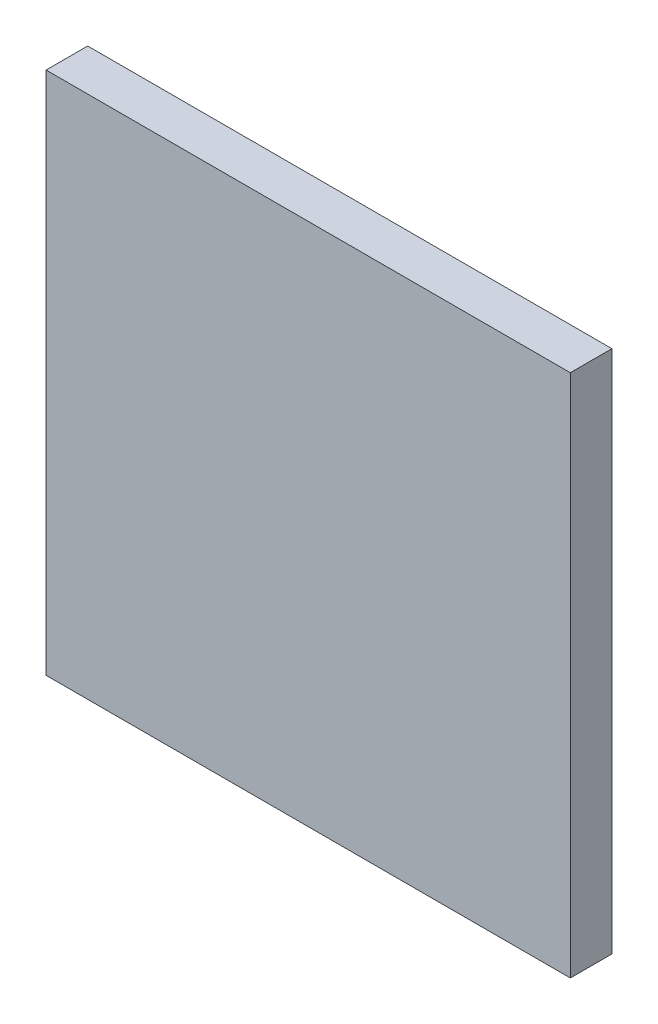
ISO-10303-21;
HEADER;
FILE_DESCRIPTION(('STEP AP214'),'2;1');
FILE_NAME('part.step','',(''),(''),'','','');
FILE_SCHEMA(('AUTOMOTIVE_DESIGN { 1 0 10303 214 1 1 1 1 }'));
ENDSEC;
DATA;
#1=APPLICATION_CONTEXT('core data for automotive mechanical design processes');
#2=APPLICATION_PROTOCOL_DEFINITION('international standard','automotive_design',2000,#1);
#3=PRODUCT_CONTEXT('',#1,'mechanical');
#4=PRODUCT('Part','Part','',(#3));
#5=PRODUCT_RELATED_PRODUCT_CATEGORY('part','',(#4));
#6=PRODUCT_DEFINITION_FORMATION('','',#4);
#7=PRODUCT_DEFINITION_CONTEXT('part definition',#1,'design');
#8=PRODUCT_DEFINITION('design','',#6,#7);
#9=PRODUCT_DEFINITION_SHAPE('','',#8);
#10=(LENGTH_UNIT() NAMED_UNIT(*) SI_UNIT(.MILLI.,.METRE.));
#11=(NAMED_UNIT(*) PLANE_ANGLE_UNIT() SI_UNIT($,.RADIAN.));
#12=(NAMED_UNIT(*) SI_UNIT($,.STERADIAN.) SOLID_ANGLE_UNIT());
#13=UNCERTAINTY_MEASURE_WITH_UNIT(LENGTH_MEASURE(1.E-05),#10,'distance_accuracy_value','');
#14=(GEOMETRIC_REPRESENTATION_CONTEXT(3) GLOBAL_UNCERTAINTY_ASSIGNED_CONTEXT((#13)) GLOBAL_UNIT_ASSIGNED_CONTEXT((#10,
#11,#12)) REPRESENTATION_CONTEXT('',''));
#15=CARTESIAN_POINT('',(0.,0.,0.));
#16=DIRECTION('',(0.,0.,1.));
#17=DIRECTION('',(1.,0.,0.));
#18=AXIS2_PLACEMENT_3D('',#15,#16,#17);
#19=CARTESIAN_POINT('',(0.,0.,0.));
#20=DIRECTION('',(0.,0.,1.));
#21=DIRECTION('',(1.,0.,0.));
#22=AXIS2_PLACEMENT_3D('',#19,#20,#21);
#23=PLANE('',#22);
#24=DIRECTION('',(0.,1.,0.));
#25=VECTOR('',#24,1.);
#26=CARTESIAN_POINT('',(-6.3,6.3,0.));
#27=LINE('',#26,#25);
#28=CARTESIAN_POINT('',(-6.3,6.3,0.));
#29=VERTEX_POINT('',#28);
#30=CARTESIAN_POINT('',(-6.3,-6.3,0.));
#31=VERTEX_POINT('',#30);
#32=EDGE_CURVE('E79',#29,#31,#27,.F.);
#33=ORIENTED_EDGE('',*,*,#32,.F.);
#34=DIRECTION('',(1.,0.,0.));
#35=VECTOR('',#34,1.);
#36=CARTESIAN_POINT('',(6.3,6.3,0.));
#37=LINE('',#36,#35);
#38=CARTESIAN_POINT('',(6.3,6.3,0.));
#39=VERTEX_POINT('',#38);
#40=EDGE_CURVE('E55',#39,#29,#37,.F.);
#41=ORIENTED_EDGE('',*,*,#40,.F.);
#42=DIRECTION('',(0.,1.,0.));
#43=VECTOR('',#42,1.);
#44=CARTESIAN_POINT('',(6.3,-6.3,0.));
#45=LINE('',#44,#43);
#46=CARTESIAN_POINT('',(6.3,-6.3,0.));
#47=VERTEX_POINT('',#46);
#48=EDGE_CURVE('E57',#47,#39,#45,.T.);
#49=ORIENTED_EDGE('',*,*,#48,.F.);
#50=DIRECTION('',(1.,0.,0.));
#51=VECTOR('',#50,1.);
#52=CARTESIAN_POINT('',(-6.3,-6.3,0.));
#53=LINE('',#52,#51);
#54=EDGE_CURVE('E20',#31,#47,#53,.T.);
#55=ORIENTED_EDGE('',*,*,#54,.F.);
#56=EDGE_LOOP('',(#33,#41,#49,#55));
#57=FACE_BOUND('',#56,.T.);
#58=ADVANCED_FACE('F17',(#57),#23,.F.);
#59=CARTESIAN_POINT('',(-6.3,-6.3,0.));
#60=DIRECTION('',(0.,-1.,0.));
#61=DIRECTION('',(0.,0.,-1.));
#62=AXIS2_PLACEMENT_3D('',#59,#60,#61);
#63=PLANE('',#62);
#64=DIRECTION('',(1.,0.,0.));
#65=VECTOR('',#64,1.);
#66=CARTESIAN_POINT('',(0.,-6.3,1.));
#67=LINE('',#66,#65);
#68=CARTESIAN_POINT('',(-6.3,-6.3,1.));
#69=VERTEX_POINT('',#68);
#70=CARTESIAN_POINT('',(6.3,-6.3,1.));
#71=VERTEX_POINT('',#70);
#72=EDGE_CURVE('E83',#69,#71,#67,.T.);
#73=ORIENTED_EDGE('',*,*,#72,.F.);
#74=DIRECTION('',(0.,0.,1.));
#75=VECTOR('',#74,1.);
#76=CARTESIAN_POINT('',(-6.3,-6.3,0.));
#77=LINE('',#76,#75);
#78=EDGE_CURVE('E68',#31,#69,#77,.T.);
#79=ORIENTED_EDGE('',*,*,#78,.F.);
#80=ORIENTED_EDGE('',*,*,#54,.T.);
#81=DIRECTION('',(0.,0.,-1.));
#82=VECTOR('',#81,1.);
#83=CARTESIAN_POINT('',(6.3,-6.3,0.));
#84=LINE('',#83,#82);
#85=EDGE_CURVE('E63',#71,#47,#84,.T.);
#86=ORIENTED_EDGE('',*,*,#85,.F.);
#87=EDGE_LOOP('',(#73,#79,#80,#86));
#88=FACE_BOUND('',#87,.T.);
#89=ADVANCED_FACE('F65',(#88),#63,.T.);
#90=CARTESIAN_POINT('',(6.3,-6.3,0.));
#91=DIRECTION('',(1.,0.,0.));
#92=DIRECTION('',(0.,0.,-1.));
#93=AXIS2_PLACEMENT_3D('',#90,#91,#92);
#94=PLANE('',#93);
#95=DIRECTION('',(0.,1.,0.));
#96=VECTOR('',#95,1.);
#97=CARTESIAN_POINT('',(6.3,0.,1.));
#98=LINE('',#97,#96);
#99=CARTESIAN_POINT('',(6.3,6.3,1.));
#100=VERTEX_POINT('',#99);
#101=EDGE_CURVE('E72',#71,#100,#98,.T.);
#102=ORIENTED_EDGE('',*,*,#101,.F.);
#103=ORIENTED_EDGE('',*,*,#85,.T.);
#104=ORIENTED_EDGE('',*,*,#48,.T.);
#105=DIRECTION('',(0.,0.,1.));
#106=VECTOR('',#105,1.);
#107=CARTESIAN_POINT('',(6.3,6.3,0.));
#108=LINE('',#107,#106);
#109=EDGE_CURVE('E75',#100,#39,#108,.F.);
#110=ORIENTED_EDGE('',*,*,#109,.F.);
#111=EDGE_LOOP('',(#102,#103,#104,#110));
#112=FACE_BOUND('',#111,.T.);
#113=ADVANCED_FACE('F70',(#112),#94,.T.);
#114=CARTESIAN_POINT('',(6.3,6.3,0.));
#115=DIRECTION('',(0.,1.,0.));
#116=DIRECTION('',(0.,0.,1.));
#117=AXIS2_PLACEMENT_3D('',#114,#115,#116);
#118=PLANE('',#117);
#119=DIRECTION('',(1.,0.,0.));
#120=VECTOR('',#119,1.);
#121=CARTESIAN_POINT('',(0.,6.3,1.));
#122=LINE('',#121,#120);
#123=CARTESIAN_POINT('',(-6.3,6.3,1.));
#124=VERTEX_POINT('',#123);
#125=EDGE_CURVE('E26',#100,#124,#122,.F.);
#126=ORIENTED_EDGE('',*,*,#125,.F.);
#127=ORIENTED_EDGE('',*,*,#109,.T.);
#128=ORIENTED_EDGE('',*,*,#40,.T.);
#129=DIRECTION('',(0.,0.,1.));
#130=VECTOR('',#129,1.);
#131=CARTESIAN_POINT('',(-6.3,6.3,0.));
#132=LINE('',#131,#130);
#133=EDGE_CURVE('E35',#124,#29,#132,.F.);
#134=ORIENTED_EDGE('',*,*,#133,.F.);
#135=EDGE_LOOP('',(#126,#127,#128,#134));
#136=FACE_BOUND('',#135,.T.);
#137=ADVANCED_FACE('F89',(#136),#118,.T.);
#138=CARTESIAN_POINT('',(-6.3,6.3,0.));
#139=DIRECTION('',(-1.,0.,0.));
#140=DIRECTION('',(0.,0.,1.));
#141=AXIS2_PLACEMENT_3D('',#138,#139,#140);
#142=PLANE('',#141);
#143=DIRECTION('',(0.,1.,0.));
#144=VECTOR('',#143,1.);
#145=CARTESIAN_POINT('',(-6.3,0.,1.));
#146=LINE('',#145,#144);
#147=EDGE_CURVE('E11',#124,#69,#146,.F.);
#148=ORIENTED_EDGE('',*,*,#147,.F.);
#149=ORIENTED_EDGE('',*,*,#133,.T.);
#150=ORIENTED_EDGE('',*,*,#32,.T.);
#151=ORIENTED_EDGE('',*,*,#78,.T.);
#152=EDGE_LOOP('',(#148,#149,#150,#151));
#153=FACE_BOUND('',#152,.T.);
#154=ADVANCED_FACE('F91',(#153),#142,.T.);
#155=CARTESIAN_POINT('',(0.,0.,1.));
#156=DIRECTION('',(0.,0.,1.));
#157=DIRECTION('',(1.,0.,0.));
#158=AXIS2_PLACEMENT_3D('',#155,#156,#157);
#159=PLANE('',#158);
#160=ORIENTED_EDGE('',*,*,#125,.T.);
#161=ORIENTED_EDGE('',*,*,#147,.T.);
#162=ORIENTED_EDGE('',*,*,#72,.T.);
#163=ORIENTED_EDGE('',*,*,#101,.T.);
#164=EDGE_LOOP('',(#160,#161,#162,#163));
#165=FACE_BOUND('',#164,.T.);
#166=ADVANCED_FACE('F88',(#165),#159,.T.);
#167=CLOSED_SHELL('',(#58,#89,#113,#137,#154,#166));
#168=MANIFOLD_SOLID_BREP('B1',#167);
#169=ADVANCED_BREP_SHAPE_REPRESENTATION('',(#18,#168),#14);
#170=SHAPE_DEFINITION_REPRESENTATION(#9,#169);
ENDSEC;
END-ISO-10303-21;
